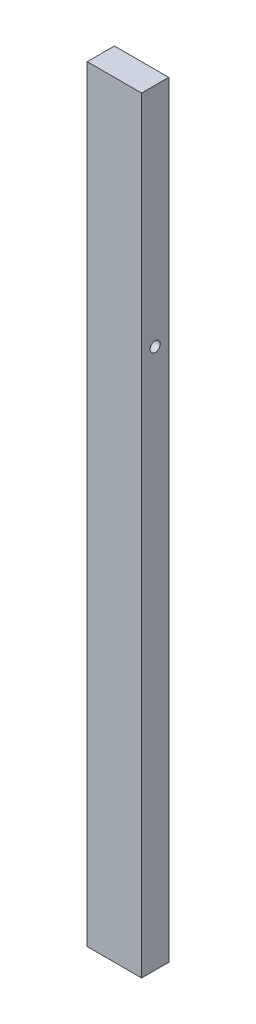
ISO-10303-21;
HEADER;
FILE_DESCRIPTION(('STEP AP214'),'2;1');
FILE_NAME('part.step','',(''),(''),'','','');
FILE_SCHEMA(('AUTOMOTIVE_DESIGN { 1 0 10303 214 1 1 1 1 }'));
ENDSEC;
DATA;
#1=APPLICATION_CONTEXT('core data for automotive mechanical design processes');
#2=APPLICATION_PROTOCOL_DEFINITION('international standard','automotive_design',2000,#1);
#3=PRODUCT_CONTEXT('',#1,'mechanical');
#4=PRODUCT('Part','Part','',(#3));
#5=PRODUCT_RELATED_PRODUCT_CATEGORY('part','',(#4));
#6=PRODUCT_DEFINITION_FORMATION('','',#4);
#7=PRODUCT_DEFINITION_CONTEXT('part definition',#1,'design');
#8=PRODUCT_DEFINITION('design','',#6,#7);
#9=PRODUCT_DEFINITION_SHAPE('','',#8);
#10=(LENGTH_UNIT() NAMED_UNIT(*) SI_UNIT(.MILLI.,.METRE.));
#11=(NAMED_UNIT(*) PLANE_ANGLE_UNIT() SI_UNIT($,.RADIAN.));
#12=(NAMED_UNIT(*) SI_UNIT($,.STERADIAN.) SOLID_ANGLE_UNIT());
#13=UNCERTAINTY_MEASURE_WITH_UNIT(LENGTH_MEASURE(1.E-05),#10,'distance_accuracy_value','');
#14=(GEOMETRIC_REPRESENTATION_CONTEXT(3) GLOBAL_UNCERTAINTY_ASSIGNED_CONTEXT((#13)) GLOBAL_UNIT_ASSIGNED_CONTEXT((#10,
#11,#12)) REPRESENTATION_CONTEXT('',''));
#15=CARTESIAN_POINT('',(0.,0.,0.));
#16=DIRECTION('',(0.,0.,1.));
#17=DIRECTION('',(1.,0.,0.));
#18=AXIS2_PLACEMENT_3D('',#15,#16,#17);
#19=CARTESIAN_POINT('',(24.,138.5,0.));
#20=DIRECTION('',(-1.,0.,0.));
#21=DIRECTION('',(0.,0.,1.));
#22=AXIS2_PLACEMENT_3D('',#19,#20,#21);
#23=CYLINDRICAL_SURFACE('',#22,4.5);
#24=CARTESIAN_POINT('',(24.,138.5,0.));
#25=DIRECTION('',(-1.,0.,0.));
#26=DIRECTION('',(0.,0.,1.));
#27=AXIS2_PLACEMENT_3D('',#24,#25,#26);
#28=CIRCLE('',#27,4.5);
#29=CARTESIAN_POINT('',(24.,138.5,4.5));
#30=VERTEX_POINT('',#29);
#31=EDGE_CURVE('E110',#30,#30,#28,.T.);
#32=ORIENTED_EDGE('',*,*,#31,.F.);
#33=EDGE_LOOP('',(#32));
#34=FACE_BOUND('',#33,.T.);
#35=CARTESIAN_POINT('',(-14.,138.5,0.));
#36=DIRECTION('',(-1.,0.,0.));
#37=DIRECTION('',(0.,0.,1.));
#38=AXIS2_PLACEMENT_3D('',#35,#36,#37);
#39=CIRCLE('',#38,4.5);
#40=CARTESIAN_POINT('',(-14.,138.5,4.5));
#41=VERTEX_POINT('',#40);
#42=EDGE_CURVE('E45',#41,#41,#39,.F.);
#43=ORIENTED_EDGE('',*,*,#42,.F.);
#44=EDGE_LOOP('',(#43));
#45=FACE_BOUND('',#44,.T.);
#46=ADVANCED_FACE('F41',(#34,#45),#23,.F.);
#47=CARTESIAN_POINT('',(24.,-338.5,12.));
#48=DIRECTION('',(-1.,0.,0.));
#49=DIRECTION('',(0.,0.,1.));
#50=AXIS2_PLACEMENT_3D('',#47,#48,#49);
#51=PLANE('',#50);
#52=ORIENTED_EDGE('',*,*,#31,.T.);
#53=EDGE_LOOP('',(#52));
#54=FACE_BOUND('',#53,.T.);
#55=DIRECTION('',(0.,1.,0.));
#56=VECTOR('',#55,1.);
#57=CARTESIAN_POINT('',(24.,-338.5,-12.));
#58=LINE('',#57,#56);
#59=CARTESIAN_POINT('',(24.,-338.5,-12.));
#60=VERTEX_POINT('',#59);
#61=CARTESIAN_POINT('',(24.,338.5,-12.));
#62=VERTEX_POINT('',#61);
#63=EDGE_CURVE('E107',#60,#62,#58,.T.);
#64=ORIENTED_EDGE('',*,*,#63,.T.);
#65=DIRECTION('',(0.,0.,-1.));
#66=VECTOR('',#65,1.);
#67=CARTESIAN_POINT('',(24.,338.5,12.));
#68=LINE('',#67,#66);
#69=CARTESIAN_POINT('',(24.,338.5,12.));
#70=VERTEX_POINT('',#69);
#71=EDGE_CURVE('E11',#70,#62,#68,.T.);
#72=ORIENTED_EDGE('',*,*,#71,.F.);
#73=DIRECTION('',(0.,1.,0.));
#74=VECTOR('',#73,1.);
#75=CARTESIAN_POINT('',(24.,-338.5,12.));
#76=LINE('',#75,#74);
#77=CARTESIAN_POINT('',(24.,-338.5,12.));
#78=VERTEX_POINT('',#77);
#79=EDGE_CURVE('E94',#78,#70,#76,.T.);
#80=ORIENTED_EDGE('',*,*,#79,.F.);
#81=DIRECTION('',(0.,0.,-1.));
#82=VECTOR('',#81,1.);
#83=CARTESIAN_POINT('',(24.,-338.5,12.));
#84=LINE('',#83,#82);
#85=EDGE_CURVE('E103',#78,#60,#84,.T.);
#86=ORIENTED_EDGE('',*,*,#85,.T.);
#87=EDGE_LOOP('',(#64,#72,#80,#86));
#88=FACE_BOUND('',#87,.T.);
#89=ADVANCED_FACE('F43',(#54,#88),#51,.F.);
#90=CARTESIAN_POINT('',(-24.,338.5,12.));
#91=DIRECTION('',(0.,-1.,0.));
#92=DIRECTION('',(0.,0.,-1.));
#93=AXIS2_PLACEMENT_3D('',#90,#91,#92);
#94=PLANE('',#93);
#95=DIRECTION('',(-1.,0.,0.));
#96=VECTOR('',#95,1.);
#97=CARTESIAN_POINT('',(-24.,338.5,-12.));
#98=LINE('',#97,#96);
#99=CARTESIAN_POINT('',(-24.,338.5,-12.));
#100=VERTEX_POINT('',#99);
#101=EDGE_CURVE('E98',#62,#100,#98,.T.);
#102=ORIENTED_EDGE('',*,*,#101,.T.);
#103=DIRECTION('',(0.,0.,-1.));
#104=VECTOR('',#103,1.);
#105=CARTESIAN_POINT('',(-24.,338.5,12.));
#106=LINE('',#105,#104);
#107=CARTESIAN_POINT('',(-24.,338.5,12.));
#108=VERTEX_POINT('',#107);
#109=EDGE_CURVE('E51',#108,#100,#106,.T.);
#110=ORIENTED_EDGE('',*,*,#109,.F.);
#111=DIRECTION('',(-1.,0.,0.));
#112=VECTOR('',#111,1.);
#113=CARTESIAN_POINT('',(-24.,338.5,12.));
#114=LINE('',#113,#112);
#115=EDGE_CURVE('E89',#70,#108,#114,.T.);
#116=ORIENTED_EDGE('',*,*,#115,.F.);
#117=ORIENTED_EDGE('',*,*,#71,.T.);
#118=EDGE_LOOP('',(#102,#110,#116,#117));
#119=FACE_BOUND('',#118,.T.);
#120=ADVANCED_FACE('F97',(#119),#94,.F.);
#121=CARTESIAN_POINT('',(-24.,-338.5,12.));
#122=DIRECTION('',(1.,0.,0.));
#123=DIRECTION('',(0.,0.,-1.));
#124=AXIS2_PLACEMENT_3D('',#121,#122,#123);
#125=PLANE('',#124);
#126=CARTESIAN_POINT('',(-24.,138.5,0.));
#127=DIRECTION('',(-1.,0.,0.));
#128=DIRECTION('',(0.,0.,1.));
#129=AXIS2_PLACEMENT_3D('',#126,#127,#128);
#130=CIRCLE('',#129,6.75);
#131=CARTESIAN_POINT('',(-24.,138.5,6.75));
#132=VERTEX_POINT('',#131);
#133=EDGE_CURVE('E123',#132,#132,#130,.T.);
#134=ORIENTED_EDGE('',*,*,#133,.F.);
#135=EDGE_LOOP('',(#134));
#136=FACE_BOUND('',#135,.T.);
#137=DIRECTION('',(0.,-1.,0.));
#138=VECTOR('',#137,1.);
#139=CARTESIAN_POINT('',(-24.,-338.5,-12.));
#140=LINE('',#139,#138);
#141=CARTESIAN_POINT('',(-24.,-338.5,-12.));
#142=VERTEX_POINT('',#141);
#143=EDGE_CURVE('E76',#100,#142,#140,.T.);
#144=ORIENTED_EDGE('',*,*,#143,.T.);
#145=DIRECTION('',(0.,0.,-1.));
#146=VECTOR('',#145,1.);
#147=CARTESIAN_POINT('',(-24.,-338.5,12.));
#148=LINE('',#147,#146);
#149=CARTESIAN_POINT('',(-24.,-338.5,12.));
#150=VERTEX_POINT('',#149);
#151=EDGE_CURVE('E99',#150,#142,#148,.T.);
#152=ORIENTED_EDGE('',*,*,#151,.F.);
#153=DIRECTION('',(0.,-1.,0.));
#154=VECTOR('',#153,1.);
#155=CARTESIAN_POINT('',(-24.,-338.5,12.));
#156=LINE('',#155,#154);
#157=EDGE_CURVE('E92',#108,#150,#156,.T.);
#158=ORIENTED_EDGE('',*,*,#157,.F.);
#159=ORIENTED_EDGE('',*,*,#109,.T.);
#160=EDGE_LOOP('',(#144,#152,#158,#159));
#161=FACE_BOUND('',#160,.T.);
#162=ADVANCED_FACE('F101',(#136,#161),#125,.F.);
#163=CARTESIAN_POINT('',(-24.,-338.5,12.));
#164=DIRECTION('',(0.,1.,0.));
#165=DIRECTION('',(0.,0.,1.));
#166=AXIS2_PLACEMENT_3D('',#163,#164,#165);
#167=PLANE('',#166);
#168=DIRECTION('',(1.,0.,0.));
#169=VECTOR('',#168,1.);
#170=CARTESIAN_POINT('',(-24.,-338.5,-12.));
#171=LINE('',#170,#169);
#172=EDGE_CURVE('E82',#142,#60,#171,.T.);
#173=ORIENTED_EDGE('',*,*,#172,.T.);
#174=ORIENTED_EDGE('',*,*,#85,.F.);
#175=DIRECTION('',(1.,0.,0.));
#176=VECTOR('',#175,1.);
#177=CARTESIAN_POINT('',(-24.,-338.5,12.));
#178=LINE('',#177,#176);
#179=EDGE_CURVE('E59',#150,#78,#178,.T.);
#180=ORIENTED_EDGE('',*,*,#179,.F.);
#181=ORIENTED_EDGE('',*,*,#151,.T.);
#182=EDGE_LOOP('',(#173,#174,#180,#181));
#183=FACE_BOUND('',#182,.T.);
#184=ADVANCED_FACE('F115',(#183),#167,.F.);
#185=CARTESIAN_POINT('',(0.,0.,12.));
#186=DIRECTION('',(0.,0.,-1.));
#187=DIRECTION('',(-1.,0.,0.));
#188=AXIS2_PLACEMENT_3D('',#185,#186,#187);
#189=PLANE('',#188);
#190=ORIENTED_EDGE('',*,*,#79,.T.);
#191=ORIENTED_EDGE('',*,*,#115,.T.);
#192=ORIENTED_EDGE('',*,*,#157,.T.);
#193=ORIENTED_EDGE('',*,*,#179,.T.);
#194=EDGE_LOOP('',(#190,#191,#192,#193));
#195=FACE_BOUND('',#194,.T.);
#196=ADVANCED_FACE('F90',(#195),#189,.F.);
#197=CARTESIAN_POINT('',(0.,0.,-12.));
#198=DIRECTION('',(0.,0.,-1.));
#199=DIRECTION('',(-1.,0.,0.));
#200=AXIS2_PLACEMENT_3D('',#197,#198,#199);
#201=PLANE('',#200);
#202=ORIENTED_EDGE('',*,*,#63,.F.);
#203=ORIENTED_EDGE('',*,*,#172,.F.);
#204=ORIENTED_EDGE('',*,*,#143,.F.);
#205=ORIENTED_EDGE('',*,*,#101,.F.);
#206=EDGE_LOOP('',(#202,#203,#204,#205));
#207=FACE_BOUND('',#206,.T.);
#208=ADVANCED_FACE('F118',(#207),#201,.T.);
#209=CARTESIAN_POINT('',(-14.,138.5,0.));
#210=DIRECTION('',(-1.,0.,0.));
#211=DIRECTION('',(0.,0.,1.));
#212=AXIS2_PLACEMENT_3D('',#209,#210,#211);
#213=PLANE('',#212);
#214=CARTESIAN_POINT('',(-14.,138.5,0.));
#215=DIRECTION('',(-1.,0.,0.));
#216=DIRECTION('',(0.,0.,1.));
#217=AXIS2_PLACEMENT_3D('',#214,#215,#216);
#218=CIRCLE('',#217,6.75);
#219=CARTESIAN_POINT('',(-14.,138.5,6.75));
#220=VERTEX_POINT('',#219);
#221=EDGE_CURVE('E126',#220,#220,#218,.T.);
#222=ORIENTED_EDGE('',*,*,#221,.T.);
#223=EDGE_LOOP('',(#222));
#224=FACE_BOUND('',#223,.T.);
#225=ORIENTED_EDGE('',*,*,#42,.T.);
#226=EDGE_LOOP('',(#225));
#227=FACE_BOUND('',#226,.T.);
#228=ADVANCED_FACE('F133',(#224,#227),#213,.T.);
#229=CARTESIAN_POINT('',(-14.,138.5,0.));
#230=DIRECTION('',(-1.,0.,0.));
#231=DIRECTION('',(0.,0.,1.));
#232=AXIS2_PLACEMENT_3D('',#229,#230,#231);
#233=CYLINDRICAL_SURFACE('',#232,6.75);
#234=ORIENTED_EDGE('',*,*,#221,.F.);
#235=EDGE_LOOP('',(#234));
#236=FACE_BOUND('',#235,.T.);
#237=ORIENTED_EDGE('',*,*,#133,.T.);
#238=EDGE_LOOP('',(#237));
#239=FACE_BOUND('',#238,.T.);
#240=ADVANCED_FACE('F146',(#236,#239),#233,.F.);
#241=CLOSED_SHELL('',(#46,#89,#120,#162,#184,#196,#208,#228,#240));
#242=MANIFOLD_SOLID_BREP('B2',#241);
#243=ADVANCED_BREP_SHAPE_REPRESENTATION('',(#18,#242),#14);
#244=SHAPE_DEFINITION_REPRESENTATION(#9,#243);
ENDSEC;
END-ISO-10303-21;
